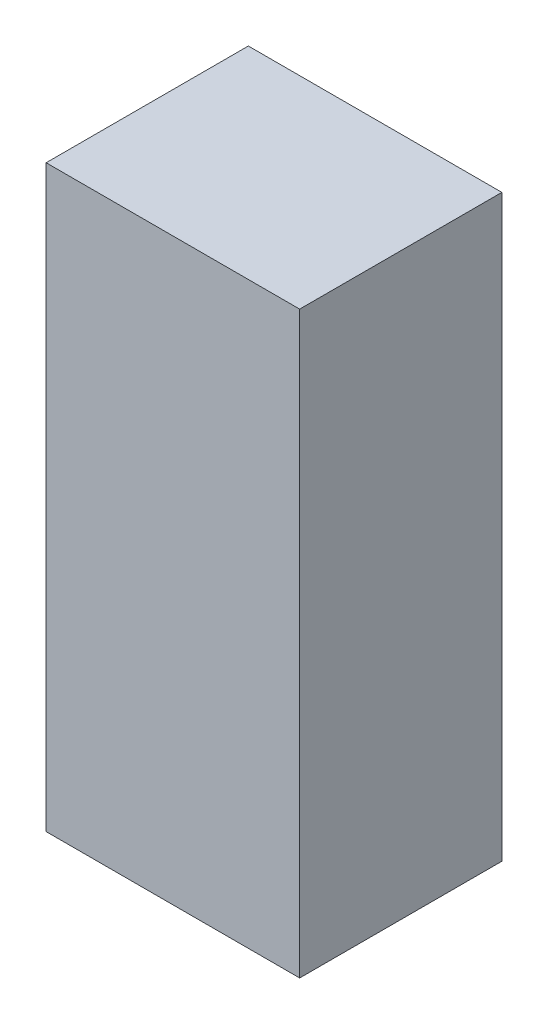
ISO-10303-21;
HEADER;
FILE_DESCRIPTION(('STEP AP214'),'2;1');
FILE_NAME('part.step','',(''),(''),'','','');
FILE_SCHEMA(('AUTOMOTIVE_DESIGN { 1 0 10303 214 1 1 1 1 }'));
ENDSEC;
DATA;
#1=APPLICATION_CONTEXT('core data for automotive mechanical design processes');
#2=APPLICATION_PROTOCOL_DEFINITION('international standard','automotive_design',2000,#1);
#3=PRODUCT_CONTEXT('',#1,'mechanical');
#4=PRODUCT('Part','Part','',(#3));
#5=PRODUCT_RELATED_PRODUCT_CATEGORY('part','',(#4));
#6=PRODUCT_DEFINITION_FORMATION('','',#4);
#7=PRODUCT_DEFINITION_CONTEXT('part definition',#1,'design');
#8=PRODUCT_DEFINITION('design','',#6,#7);
#9=PRODUCT_DEFINITION_SHAPE('','',#8);
#10=(LENGTH_UNIT() NAMED_UNIT(*) SI_UNIT(.MILLI.,.METRE.));
#11=(NAMED_UNIT(*) PLANE_ANGLE_UNIT() SI_UNIT($,.RADIAN.));
#12=(NAMED_UNIT(*) SI_UNIT($,.STERADIAN.) SOLID_ANGLE_UNIT());
#13=UNCERTAINTY_MEASURE_WITH_UNIT(LENGTH_MEASURE(1.E-05),#10,'distance_accuracy_value','');
#14=(GEOMETRIC_REPRESENTATION_CONTEXT(3) GLOBAL_UNCERTAINTY_ASSIGNED_CONTEXT((#13)) GLOBAL_UNIT_ASSIGNED_CONTEXT((#10,
#11,#12)) REPRESENTATION_CONTEXT('',''));
#15=CARTESIAN_POINT('',(0.,0.,0.));
#16=DIRECTION('',(0.,0.,1.));
#17=DIRECTION('',(1.,0.,0.));
#18=AXIS2_PLACEMENT_3D('',#15,#16,#17);
#19=CARTESIAN_POINT('',(0.,0.,0.));
#20=DIRECTION('',(0.,0.,1.));
#21=DIRECTION('',(1.,0.,0.));
#22=AXIS2_PLACEMENT_3D('',#19,#20,#21);
#23=PLANE('',#22);
#24=DIRECTION('',(0.,1.,0.));
#25=VECTOR('',#24,1.);
#26=CARTESIAN_POINT('',(11.4275710657239,-2.9,0.));
#27=LINE('',#26,#25);
#28=CARTESIAN_POINT('',(11.4275710657239,2.83,0.));
#29=VERTEX_POINT('',#28);
#30=CARTESIAN_POINT('',(11.4275710657239,-2.9,0.));
#31=VERTEX_POINT('',#30);
#32=EDGE_CURVE('E58',#29,#31,#27,.F.);
#33=ORIENTED_EDGE('',*,*,#32,.F.);
#34=DIRECTION('',(1.,0.,0.));
#35=VECTOR('',#34,1.);
#36=CARTESIAN_POINT('',(11.4275710657239,2.83,0.));
#37=LINE('',#36,#35);
#38=CARTESIAN_POINT('',(8.9198276400566,2.83,0.));
#39=VERTEX_POINT('',#38);
#40=EDGE_CURVE('E53',#39,#29,#37,.T.);
#41=ORIENTED_EDGE('',*,*,#40,.F.);
#42=DIRECTION('',(0.,1.,0.));
#43=VECTOR('',#42,1.);
#44=CARTESIAN_POINT('',(8.9198276400566,2.83,0.));
#45=LINE('',#44,#43);
#46=CARTESIAN_POINT('',(8.9198276400566,-2.9,0.));
#47=VERTEX_POINT('',#46);
#48=EDGE_CURVE('E68',#47,#39,#45,.T.);
#49=ORIENTED_EDGE('',*,*,#48,.F.);
#50=DIRECTION('',(1.,0.,0.));
#51=VECTOR('',#50,1.);
#52=CARTESIAN_POINT('',(8.9198276400566,-2.9,0.));
#53=LINE('',#52,#51);
#54=EDGE_CURVE('E20',#31,#47,#53,.F.);
#55=ORIENTED_EDGE('',*,*,#54,.F.);
#56=EDGE_LOOP('',(#33,#41,#49,#55));
#57=FACE_BOUND('',#56,.T.);
#58=ADVANCED_FACE('F17',(#57),#23,.T.);
#59=CARTESIAN_POINT('',(8.9198276400566,-2.9,-2.));
#60=DIRECTION('',(0.,-1.,0.));
#61=DIRECTION('',(0.,0.,-1.));
#62=AXIS2_PLACEMENT_3D('',#59,#60,#61);
#63=PLANE('',#62);
#64=DIRECTION('',(1.,0.,0.));
#65=VECTOR('',#64,1.);
#66=CARTESIAN_POINT('',(0.,-2.9,-2.));
#67=LINE('',#66,#65);
#68=CARTESIAN_POINT('',(8.9198276400566,-2.9,-2.));
#69=VERTEX_POINT('',#68);
#70=CARTESIAN_POINT('',(11.4275710657239,-2.9,-2.));
#71=VERTEX_POINT('',#70);
#72=EDGE_CURVE('E74',#69,#71,#67,.T.);
#73=ORIENTED_EDGE('',*,*,#72,.T.);
#74=DIRECTION('',(0.,0.,-1.));
#75=VECTOR('',#74,1.);
#76=CARTESIAN_POINT('',(11.4275710657239,-2.9,-2.));
#77=LINE('',#76,#75);
#78=EDGE_CURVE('E63',#31,#71,#77,.T.);
#79=ORIENTED_EDGE('',*,*,#78,.F.);
#80=ORIENTED_EDGE('',*,*,#54,.T.);
#81=DIRECTION('',(0.,0.,1.));
#82=VECTOR('',#81,1.);
#83=CARTESIAN_POINT('',(8.9198276400566,-2.9,-2.));
#84=LINE('',#83,#82);
#85=EDGE_CURVE('E81',#69,#47,#84,.T.);
#86=ORIENTED_EDGE('',*,*,#85,.F.);
#87=EDGE_LOOP('',(#73,#79,#80,#86));
#88=FACE_BOUND('',#87,.T.);
#89=ADVANCED_FACE('F73',(#88),#63,.T.);
#90=CARTESIAN_POINT('',(11.4275710657239,-2.9,-2.));
#91=DIRECTION('',(1.,0.,0.));
#92=DIRECTION('',(0.,0.,-1.));
#93=AXIS2_PLACEMENT_3D('',#90,#91,#92);
#94=PLANE('',#93);
#95=DIRECTION('',(0.,1.,0.));
#96=VECTOR('',#95,1.);
#97=CARTESIAN_POINT('',(11.4275710657239,0.,-2.));
#98=LINE('',#97,#96);
#99=CARTESIAN_POINT('',(11.4275710657239,2.83,-2.));
#100=VERTEX_POINT('',#99);
#101=EDGE_CURVE('E84',#71,#100,#98,.T.);
#102=ORIENTED_EDGE('',*,*,#101,.T.);
#103=DIRECTION('',(0.,0.,1.));
#104=VECTOR('',#103,1.);
#105=CARTESIAN_POINT('',(11.4275710657239,2.83,-2.));
#106=LINE('',#105,#104);
#107=EDGE_CURVE('E65',#29,#100,#106,.F.);
#108=ORIENTED_EDGE('',*,*,#107,.F.);
#109=ORIENTED_EDGE('',*,*,#32,.T.);
#110=ORIENTED_EDGE('',*,*,#78,.T.);
#111=EDGE_LOOP('',(#102,#108,#109,#110));
#112=FACE_BOUND('',#111,.T.);
#113=ADVANCED_FACE('F61',(#112),#94,.T.);
#114=CARTESIAN_POINT('',(11.4275710657239,2.83,-2.));
#115=DIRECTION('',(0.,1.,0.));
#116=DIRECTION('',(0.,0.,1.));
#117=AXIS2_PLACEMENT_3D('',#114,#115,#116);
#118=PLANE('',#117);
#119=DIRECTION('',(1.,0.,0.));
#120=VECTOR('',#119,1.);
#121=CARTESIAN_POINT('',(0.,2.83,-2.));
#122=LINE('',#121,#120);
#123=CARTESIAN_POINT('',(8.9198276400566,2.83,-2.));
#124=VERTEX_POINT('',#123);
#125=EDGE_CURVE('E26',#100,#124,#122,.F.);
#126=ORIENTED_EDGE('',*,*,#125,.T.);
#127=DIRECTION('',(0.,0.,1.));
#128=VECTOR('',#127,1.);
#129=CARTESIAN_POINT('',(8.9198276400566,2.83,-2.));
#130=LINE('',#129,#128);
#131=EDGE_CURVE('E34',#39,#124,#130,.F.);
#132=ORIENTED_EDGE('',*,*,#131,.F.);
#133=ORIENTED_EDGE('',*,*,#40,.T.);
#134=ORIENTED_EDGE('',*,*,#107,.T.);
#135=EDGE_LOOP('',(#126,#132,#133,#134));
#136=FACE_BOUND('',#135,.T.);
#137=ADVANCED_FACE('F88',(#136),#118,.T.);
#138=CARTESIAN_POINT('',(8.9198276400566,2.83,-2.));
#139=DIRECTION('',(-1.,0.,0.));
#140=DIRECTION('',(0.,0.,1.));
#141=AXIS2_PLACEMENT_3D('',#138,#139,#140);
#142=PLANE('',#141);
#143=DIRECTION('',(0.,1.,0.));
#144=VECTOR('',#143,1.);
#145=CARTESIAN_POINT('',(8.9198276400566,0.,-2.));
#146=LINE('',#145,#144);
#147=EDGE_CURVE('E11',#124,#69,#146,.F.);
#148=ORIENTED_EDGE('',*,*,#147,.T.);
#149=ORIENTED_EDGE('',*,*,#85,.T.);
#150=ORIENTED_EDGE('',*,*,#48,.T.);
#151=ORIENTED_EDGE('',*,*,#131,.T.);
#152=EDGE_LOOP('',(#148,#149,#150,#151));
#153=FACE_BOUND('',#152,.T.);
#154=ADVANCED_FACE('F91',(#153),#142,.T.);
#155=CARTESIAN_POINT('',(0.,0.,-2.));
#156=DIRECTION('',(0.,0.,1.));
#157=DIRECTION('',(1.,0.,0.));
#158=AXIS2_PLACEMENT_3D('',#155,#156,#157);
#159=PLANE('',#158);
#160=ORIENTED_EDGE('',*,*,#125,.F.);
#161=ORIENTED_EDGE('',*,*,#101,.F.);
#162=ORIENTED_EDGE('',*,*,#72,.F.);
#163=ORIENTED_EDGE('',*,*,#147,.F.);
#164=EDGE_LOOP('',(#160,#161,#162,#163));
#165=FACE_BOUND('',#164,.T.);
#166=ADVANCED_FACE('F90',(#165),#159,.F.);
#167=CLOSED_SHELL('',(#58,#89,#113,#137,#154,#166));
#168=MANIFOLD_SOLID_BREP('B1',#167);
#169=ADVANCED_BREP_SHAPE_REPRESENTATION('',(#18,#168),#14);
#170=SHAPE_DEFINITION_REPRESENTATION(#9,#169);
ENDSEC;
END-ISO-10303-21;
